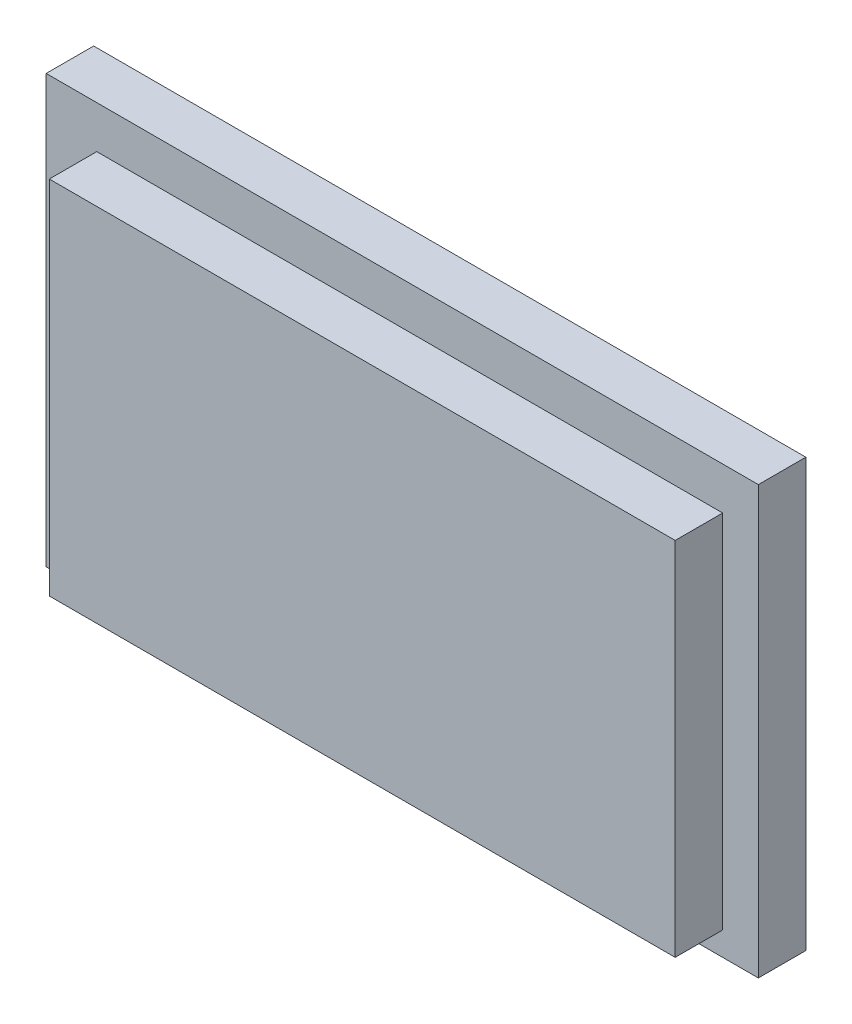
ISO-10303-21;
HEADER;
FILE_DESCRIPTION(('STEP AP214'),'2;1');
FILE_NAME('part.step','',(''),(''),'','','');
FILE_SCHEMA(('AUTOMOTIVE_DESIGN { 1 0 10303 214 1 1 1 1 }'));
ENDSEC;
DATA;
#1=APPLICATION_CONTEXT('core data for automotive mechanical design processes');
#2=APPLICATION_PROTOCOL_DEFINITION('international standard','automotive_design',2000,#1);
#3=PRODUCT_CONTEXT('',#1,'mechanical');
#4=PRODUCT('Part','Part','',(#3));
#5=PRODUCT_RELATED_PRODUCT_CATEGORY('part','',(#4));
#6=PRODUCT_DEFINITION_FORMATION('','',#4);
#7=PRODUCT_DEFINITION_CONTEXT('part definition',#1,'design');
#8=PRODUCT_DEFINITION('design','',#6,#7);
#9=PRODUCT_DEFINITION_SHAPE('','',#8);
#10=(LENGTH_UNIT() NAMED_UNIT(*) SI_UNIT(.MILLI.,.METRE.));
#11=(NAMED_UNIT(*) PLANE_ANGLE_UNIT() SI_UNIT($,.RADIAN.));
#12=(NAMED_UNIT(*) SI_UNIT($,.STERADIAN.) SOLID_ANGLE_UNIT());
#13=UNCERTAINTY_MEASURE_WITH_UNIT(LENGTH_MEASURE(1.E-05),#10,'distance_accuracy_value','');
#14=(GEOMETRIC_REPRESENTATION_CONTEXT(3) GLOBAL_UNCERTAINTY_ASSIGNED_CONTEXT((#13)) GLOBAL_UNIT_ASSIGNED_CONTEXT((#10,
#11,#12)) REPRESENTATION_CONTEXT('',''));
#15=CARTESIAN_POINT('',(0.,0.,0.));
#16=DIRECTION('',(0.,0.,1.));
#17=DIRECTION('',(1.,0.,0.));
#18=AXIS2_PLACEMENT_3D('',#15,#16,#17);
#19=CARTESIAN_POINT('',(-16.5978421445907,10.0675444512405,2.));
#20=DIRECTION('',(1.,0.,0.));
#21=DIRECTION('',(0.,1.,0.));
#22=AXIS2_PLACEMENT_3D('',#19,#20,#21);
#23=PLANE('',#22);
#24=DIRECTION('',(0.,-1.,0.));
#25=VECTOR('',#24,1.);
#26=CARTESIAN_POINT('',(-16.5978421445907,10.0675444512405,0.));
#27=LINE('',#26,#25);
#28=CARTESIAN_POINT('',(-16.5978421445907,10.0675444512405,0.));
#29=VERTEX_POINT('',#28);
#30=CARTESIAN_POINT('',(-16.5978421445906,-7.93245554875947,0.));
#31=VERTEX_POINT('',#30);
#32=EDGE_CURVE('E120',#29,#31,#27,.T.);
#33=ORIENTED_EDGE('',*,*,#32,.T.);
#34=DIRECTION('',(0.,0.,-1.));
#35=VECTOR('',#34,1.);
#36=CARTESIAN_POINT('',(-16.5978421445906,-7.93245554875947,2.));
#37=LINE('',#36,#35);
#38=CARTESIAN_POINT('',(-16.5978421445906,-7.93245554875947,2.));
#39=VERTEX_POINT('',#38);
#40=EDGE_CURVE('E11',#39,#31,#37,.T.);
#41=ORIENTED_EDGE('',*,*,#40,.F.);
#42=DIRECTION('',(0.,-1.,0.));
#43=VECTOR('',#42,1.);
#44=CARTESIAN_POINT('',(-16.5978421445907,10.0675444512405,2.));
#45=LINE('',#44,#43);
#46=CARTESIAN_POINT('',(-16.5978421445907,10.0675444512405,2.));
#47=VERTEX_POINT('',#46);
#48=EDGE_CURVE('E129',#47,#39,#45,.T.);
#49=ORIENTED_EDGE('',*,*,#48,.F.);
#50=DIRECTION('',(0.,0.,-1.));
#51=VECTOR('',#50,1.);
#52=CARTESIAN_POINT('',(-16.5978421445907,10.0675444512405,2.));
#53=LINE('',#52,#51);
#54=EDGE_CURVE('E138',#47,#29,#53,.T.);
#55=ORIENTED_EDGE('',*,*,#54,.T.);
#56=EDGE_LOOP('',(#33,#41,#49,#55));
#57=FACE_BOUND('',#56,.T.);
#58=ADVANCED_FACE('F36',(#57),#23,.F.);
#59=CARTESIAN_POINT('',(-16.5978421445906,-7.93245554875947,2.));
#60=DIRECTION('',(0.,1.,0.));
#61=DIRECTION('',(0.,0.,1.));
#62=AXIS2_PLACEMENT_3D('',#59,#60,#61);
#63=PLANE('',#62);
#64=DIRECTION('',(1.,0.,0.));
#65=VECTOR('',#64,1.);
#66=CARTESIAN_POINT('',(-16.5978421445906,-7.93245554875947,0.));
#67=LINE('',#66,#65);
#68=CARTESIAN_POINT('',(13.4021578554094,-7.93245554875947,0.));
#69=VERTEX_POINT('',#68);
#70=EDGE_CURVE('E123',#31,#69,#67,.T.);
#71=ORIENTED_EDGE('',*,*,#70,.T.);
#72=DIRECTION('',(0.,0.,-1.));
#73=VECTOR('',#72,1.);
#74=CARTESIAN_POINT('',(13.4021578554094,-7.93245554875947,2.));
#75=LINE('',#74,#73);
#76=CARTESIAN_POINT('',(13.4021578554094,-7.93245554875947,2.));
#77=VERTEX_POINT('',#76);
#78=EDGE_CURVE('E43',#77,#69,#75,.T.);
#79=ORIENTED_EDGE('',*,*,#78,.F.);
#80=DIRECTION('',(1.,0.,0.));
#81=VECTOR('',#80,1.);
#82=CARTESIAN_POINT('',(-16.5978421445906,-7.93245554875947,2.));
#83=LINE('',#82,#81);
#84=EDGE_CURVE('E132',#39,#77,#83,.T.);
#85=ORIENTED_EDGE('',*,*,#84,.F.);
#86=ORIENTED_EDGE('',*,*,#40,.T.);
#87=EDGE_LOOP('',(#71,#79,#85,#86));
#88=FACE_BOUND('',#87,.T.);
#89=ADVANCED_FACE('F169',(#88),#63,.F.);
#90=CARTESIAN_POINT('',(13.4021578554093,10.0675444512405,2.));
#91=DIRECTION('',(-1.,0.,0.));
#92=DIRECTION('',(0.,-1.,0.));
#93=AXIS2_PLACEMENT_3D('',#90,#91,#92);
#94=PLANE('',#93);
#95=DIRECTION('',(0.,1.,0.));
#96=VECTOR('',#95,1.);
#97=CARTESIAN_POINT('',(13.4021578554093,10.0675444512405,0.));
#98=LINE('',#97,#96);
#99=CARTESIAN_POINT('',(13.4021578554093,10.0675444512405,0.));
#100=VERTEX_POINT('',#99);
#101=EDGE_CURVE('E141',#69,#100,#98,.T.);
#102=ORIENTED_EDGE('',*,*,#101,.T.);
#103=DIRECTION('',(0.,0.,-1.));
#104=VECTOR('',#103,1.);
#105=CARTESIAN_POINT('',(13.4021578554093,10.0675444512405,2.));
#106=LINE('',#105,#104);
#107=CARTESIAN_POINT('',(13.4021578554093,10.0675444512405,2.));
#108=VERTEX_POINT('',#107);
#109=EDGE_CURVE('E146',#108,#100,#106,.T.);
#110=ORIENTED_EDGE('',*,*,#109,.F.);
#111=DIRECTION('',(0.,1.,0.));
#112=VECTOR('',#111,1.);
#113=CARTESIAN_POINT('',(13.4021578554093,10.0675444512405,2.));
#114=LINE('',#113,#112);
#115=EDGE_CURVE('E135',#77,#108,#114,.T.);
#116=ORIENTED_EDGE('',*,*,#115,.F.);
#117=ORIENTED_EDGE('',*,*,#78,.T.);
#118=EDGE_LOOP('',(#102,#110,#116,#117));
#119=FACE_BOUND('',#118,.T.);
#120=ADVANCED_FACE('F153',(#119),#94,.F.);
#121=CARTESIAN_POINT('',(-16.5978421445907,10.0675444512405,2.));
#122=DIRECTION('',(0.,-1.,0.));
#123=DIRECTION('',(0.,0.,-1.));
#124=AXIS2_PLACEMENT_3D('',#121,#122,#123);
#125=PLANE('',#124);
#126=DIRECTION('',(-1.,0.,0.));
#127=VECTOR('',#126,1.);
#128=CARTESIAN_POINT('',(-16.5978421445907,10.0675444512405,0.));
#129=LINE('',#128,#127);
#130=EDGE_CURVE('E133',#100,#29,#129,.T.);
#131=ORIENTED_EDGE('',*,*,#130,.T.);
#132=ORIENTED_EDGE('',*,*,#54,.F.);
#133=DIRECTION('',(-1.,0.,0.));
#134=VECTOR('',#133,1.);
#135=CARTESIAN_POINT('',(-16.5978421445907,10.0675444512405,2.));
#136=LINE('',#135,#134);
#137=EDGE_CURVE('E137',#108,#47,#136,.T.);
#138=ORIENTED_EDGE('',*,*,#137,.F.);
#139=ORIENTED_EDGE('',*,*,#109,.T.);
#140=EDGE_LOOP('',(#131,#132,#138,#139));
#141=FACE_BOUND('',#140,.T.);
#142=ADVANCED_FACE('F162',(#141),#125,.F.);
#143=CARTESIAN_POINT('',(0.,0.,2.));
#144=DIRECTION('',(0.,0.,1.));
#145=DIRECTION('',(1.,0.,0.));
#146=AXIS2_PLACEMENT_3D('',#143,#144,#145);
#147=PLANE('',#146);
#148=DIRECTION('',(0.,-1.,0.));
#149=VECTOR('',#148,1.);
#150=CARTESIAN_POINT('',(-14.4662240415717,8.28024864947541,2.));
#151=LINE('',#150,#149);
#152=CARTESIAN_POINT('',(-14.4662240415717,8.28024864947541,2.));
#153=VERTEX_POINT('',#152);
#154=CARTESIAN_POINT('',(-14.4662240415717,-6.93161442076613,2.));
#155=VERTEX_POINT('',#154);
#156=EDGE_CURVE('E50',#153,#155,#151,.T.);
#157=ORIENTED_EDGE('',*,*,#156,.F.);
#158=DIRECTION('',(-1.,0.,0.));
#159=VECTOR('',#158,1.);
#160=CARTESIAN_POINT('',(-14.4662240415717,8.28024864947541,2.));
#161=LINE('',#160,#159);
#162=CARTESIAN_POINT('',(11.8993037295013,8.28024864947541,2.));
#163=VERTEX_POINT('',#162);
#164=EDGE_CURVE('E54',#163,#153,#161,.T.);
#165=ORIENTED_EDGE('',*,*,#164,.F.);
#166=DIRECTION('',(0.,1.,0.));
#167=VECTOR('',#166,1.);
#168=CARTESIAN_POINT('',(11.8993037295013,8.28024864947541,2.));
#169=LINE('',#168,#167);
#170=CARTESIAN_POINT('',(11.8993037295013,-6.93161442076613,2.));
#171=VERTEX_POINT('',#170);
#172=EDGE_CURVE('E263',#171,#163,#169,.T.);
#173=ORIENTED_EDGE('',*,*,#172,.F.);
#174=DIRECTION('',(1.,0.,0.));
#175=VECTOR('',#174,1.);
#176=CARTESIAN_POINT('',(-14.4662240415717,-6.93161442076613,2.));
#177=LINE('',#176,#175);
#178=EDGE_CURVE('E269',#155,#171,#177,.T.);
#179=ORIENTED_EDGE('',*,*,#178,.F.);
#180=EDGE_LOOP('',(#157,#165,#173,#179));
#181=FACE_BOUND('',#180,.T.);
#182=ORIENTED_EDGE('',*,*,#48,.T.);
#183=ORIENTED_EDGE('',*,*,#84,.T.);
#184=ORIENTED_EDGE('',*,*,#115,.T.);
#185=ORIENTED_EDGE('',*,*,#137,.T.);
#186=EDGE_LOOP('',(#182,#183,#184,#185));
#187=FACE_BOUND('',#186,.T.);
#188=ADVANCED_FACE('F168',(#181,#187),#147,.T.);
#189=CARTESIAN_POINT('',(0.,0.,0.));
#190=DIRECTION('',(0.,0.,1.));
#191=DIRECTION('',(1.,0.,0.));
#192=AXIS2_PLACEMENT_3D('',#189,#190,#191);
#193=PLANE('',#192);
#194=ORIENTED_EDGE('',*,*,#32,.F.);
#195=ORIENTED_EDGE('',*,*,#130,.F.);
#196=ORIENTED_EDGE('',*,*,#101,.F.);
#197=ORIENTED_EDGE('',*,*,#70,.F.);
#198=EDGE_LOOP('',(#194,#195,#196,#197));
#199=FACE_BOUND('',#198,.T.);
#200=ADVANCED_FACE('F159',(#199),#193,.F.);
#201=CARTESIAN_POINT('',(-14.4662240415717,8.28024864947541,4.));
#202=DIRECTION('',(1.,0.,0.));
#203=DIRECTION('',(0.,0.,-1.));
#204=AXIS2_PLACEMENT_3D('',#201,#202,#203);
#205=PLANE('',#204);
#206=ORIENTED_EDGE('',*,*,#156,.T.);
#207=DIRECTION('',(0.,0.,-1.));
#208=VECTOR('',#207,1.);
#209=CARTESIAN_POINT('',(-14.4662240415717,-6.93161442076613,4.));
#210=LINE('',#209,#208);
#211=CARTESIAN_POINT('',(-14.4662240415717,-6.93161442076613,4.));
#212=VERTEX_POINT('',#211);
#213=EDGE_CURVE('E103',#212,#155,#210,.T.);
#214=ORIENTED_EDGE('',*,*,#213,.F.);
#215=DIRECTION('',(0.,-1.,0.));
#216=VECTOR('',#215,1.);
#217=CARTESIAN_POINT('',(-14.4662240415717,8.28024864947541,4.));
#218=LINE('',#217,#216);
#219=CARTESIAN_POINT('',(-14.4662240415717,8.28024864947541,4.));
#220=VERTEX_POINT('',#219);
#221=EDGE_CURVE('E109',#220,#212,#218,.T.);
#222=ORIENTED_EDGE('',*,*,#221,.F.);
#223=DIRECTION('',(0.,0.,-1.));
#224=VECTOR('',#223,1.);
#225=CARTESIAN_POINT('',(-14.4662240415717,8.28024864947541,4.));
#226=LINE('',#225,#224);
#227=EDGE_CURVE('E261',#220,#153,#226,.T.);
#228=ORIENTED_EDGE('',*,*,#227,.T.);
#229=EDGE_LOOP('',(#206,#214,#222,#228));
#230=FACE_BOUND('',#229,.T.);
#231=ADVANCED_FACE('F119',(#230),#205,.F.);
#232=CARTESIAN_POINT('',(-14.4662240415717,-6.93161442076613,4.));
#233=DIRECTION('',(0.,1.,0.));
#234=DIRECTION('',(0.,0.,1.));
#235=AXIS2_PLACEMENT_3D('',#232,#233,#234);
#236=PLANE('',#235);
#237=ORIENTED_EDGE('',*,*,#178,.T.);
#238=DIRECTION('',(0.,0.,-1.));
#239=VECTOR('',#238,1.);
#240=CARTESIAN_POINT('',(11.8993037295013,-6.93161442076613,4.));
#241=LINE('',#240,#239);
#242=CARTESIAN_POINT('',(11.8993037295013,-6.93161442076613,4.));
#243=VERTEX_POINT('',#242);
#244=EDGE_CURVE('E105',#243,#171,#241,.T.);
#245=ORIENTED_EDGE('',*,*,#244,.F.);
#246=DIRECTION('',(1.,0.,0.));
#247=VECTOR('',#246,1.);
#248=CARTESIAN_POINT('',(-14.4662240415717,-6.93161442076613,4.));
#249=LINE('',#248,#247);
#250=EDGE_CURVE('E98',#212,#243,#249,.T.);
#251=ORIENTED_EDGE('',*,*,#250,.F.);
#252=ORIENTED_EDGE('',*,*,#213,.T.);
#253=EDGE_LOOP('',(#237,#245,#251,#252));
#254=FACE_BOUND('',#253,.T.);
#255=ADVANCED_FACE('F101',(#254),#236,.F.);
#256=CARTESIAN_POINT('',(11.8993037295013,8.28024864947541,4.));
#257=DIRECTION('',(-1.,0.,0.));
#258=DIRECTION('',(0.,0.,1.));
#259=AXIS2_PLACEMENT_3D('',#256,#257,#258);
#260=PLANE('',#259);
#261=ORIENTED_EDGE('',*,*,#172,.T.);
#262=DIRECTION('',(0.,0.,-1.));
#263=VECTOR('',#262,1.);
#264=CARTESIAN_POINT('',(11.8993037295013,8.28024864947541,4.));
#265=LINE('',#264,#263);
#266=CARTESIAN_POINT('',(11.8993037295013,8.28024864947541,4.));
#267=VERTEX_POINT('',#266);
#268=EDGE_CURVE('E125',#267,#163,#265,.T.);
#269=ORIENTED_EDGE('',*,*,#268,.F.);
#270=DIRECTION('',(0.,1.,0.));
#271=VECTOR('',#270,1.);
#272=CARTESIAN_POINT('',(11.8993037295013,8.28024864947541,4.));
#273=LINE('',#272,#271);
#274=EDGE_CURVE('E108',#243,#267,#273,.T.);
#275=ORIENTED_EDGE('',*,*,#274,.F.);
#276=ORIENTED_EDGE('',*,*,#244,.T.);
#277=EDGE_LOOP('',(#261,#269,#275,#276));
#278=FACE_BOUND('',#277,.T.);
#279=ADVANCED_FACE('F187',(#278),#260,.F.);
#280=CARTESIAN_POINT('',(-14.4662240415717,8.28024864947541,4.));
#281=DIRECTION('',(0.,-1.,0.));
#282=DIRECTION('',(0.,0.,-1.));
#283=AXIS2_PLACEMENT_3D('',#280,#281,#282);
#284=PLANE('',#283);
#285=ORIENTED_EDGE('',*,*,#164,.T.);
#286=ORIENTED_EDGE('',*,*,#227,.F.);
#287=DIRECTION('',(-1.,0.,0.));
#288=VECTOR('',#287,1.);
#289=CARTESIAN_POINT('',(-14.4662240415717,8.28024864947541,4.));
#290=LINE('',#289,#288);
#291=EDGE_CURVE('E114',#267,#220,#290,.T.);
#292=ORIENTED_EDGE('',*,*,#291,.F.);
#293=ORIENTED_EDGE('',*,*,#268,.T.);
#294=EDGE_LOOP('',(#285,#286,#292,#293));
#295=FACE_BOUND('',#294,.T.);
#296=ADVANCED_FACE('F190',(#295),#284,.F.);
#297=CARTESIAN_POINT('',(0.,0.,4.));
#298=DIRECTION('',(0.,0.,1.));
#299=DIRECTION('',(1.,0.,0.));
#300=AXIS2_PLACEMENT_3D('',#297,#298,#299);
#301=PLANE('',#300);
#302=ORIENTED_EDGE('',*,*,#221,.T.);
#303=ORIENTED_EDGE('',*,*,#250,.T.);
#304=ORIENTED_EDGE('',*,*,#274,.T.);
#305=ORIENTED_EDGE('',*,*,#291,.T.);
#306=EDGE_LOOP('',(#302,#303,#304,#305));
#307=FACE_BOUND('',#306,.T.);
#308=ADVANCED_FACE('F112',(#307),#301,.T.);
#309=CLOSED_SHELL('',(#58,#89,#120,#142,#188,#200,#231,#255,#279,#296,#308));
#310=MANIFOLD_SOLID_BREP('B2',#309);
#311=ADVANCED_BREP_SHAPE_REPRESENTATION('',(#18,#310),#14);
#312=SHAPE_DEFINITION_REPRESENTATION(#9,#311);
ENDSEC;
END-ISO-10303-21;
